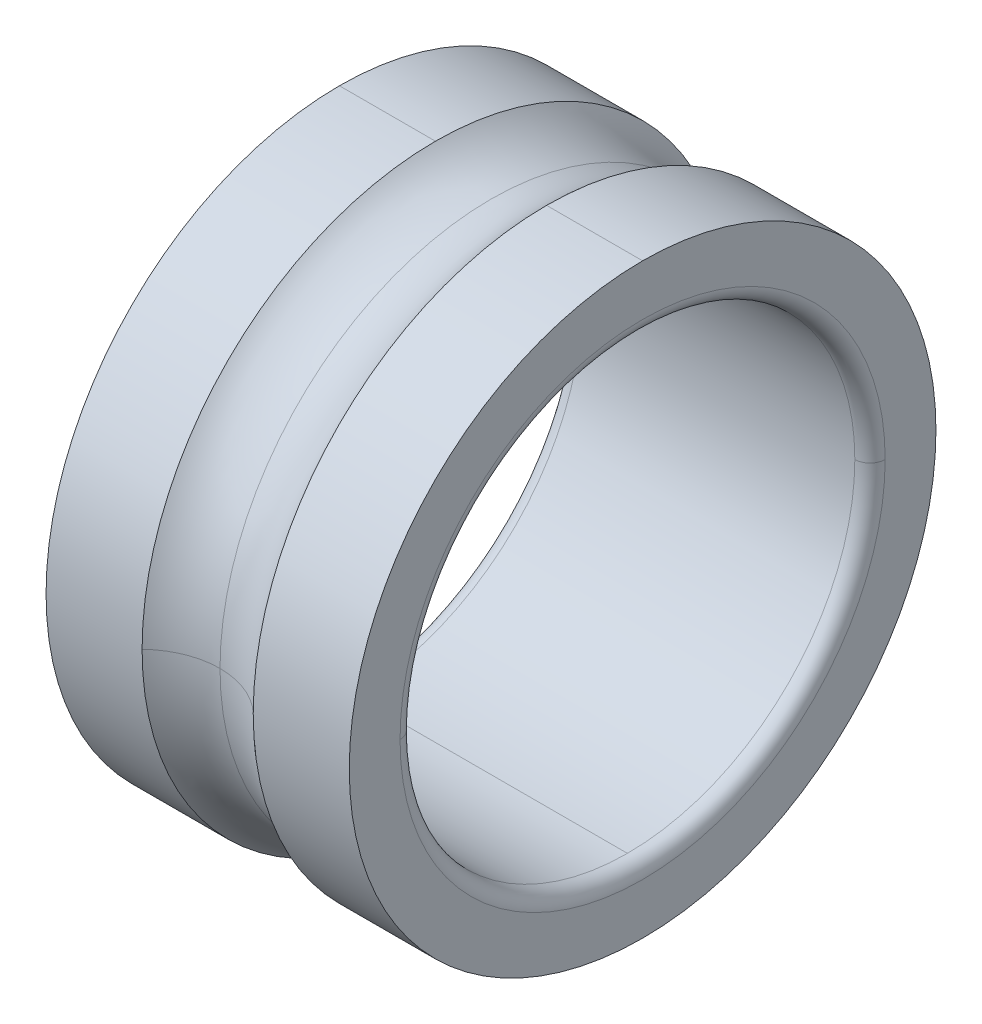
ISO-10303-21;
HEADER;
FILE_DESCRIPTION(('STEP AP214'),'2;1');
FILE_NAME('part.step','',(''),(''),'','','');
FILE_SCHEMA(('AUTOMOTIVE_DESIGN { 1 0 10303 214 1 1 1 1 }'));
ENDSEC;
DATA;
#1=APPLICATION_CONTEXT('core data for automotive mechanical design processes');
#2=APPLICATION_PROTOCOL_DEFINITION('international standard','automotive_design',2000,#1);
#3=PRODUCT_CONTEXT('',#1,'mechanical');
#4=PRODUCT('Part','Part','',(#3));
#5=PRODUCT_RELATED_PRODUCT_CATEGORY('part','',(#4));
#6=PRODUCT_DEFINITION_FORMATION('','',#4);
#7=PRODUCT_DEFINITION_CONTEXT('part definition',#1,'design');
#8=PRODUCT_DEFINITION('design','',#6,#7);
#9=PRODUCT_DEFINITION_SHAPE('','',#8);
#10=(LENGTH_UNIT() NAMED_UNIT(*) SI_UNIT(.MILLI.,.METRE.));
#11=(NAMED_UNIT(*) PLANE_ANGLE_UNIT() SI_UNIT($,.RADIAN.));
#12=(NAMED_UNIT(*) SI_UNIT($,.STERADIAN.) SOLID_ANGLE_UNIT());
#13=UNCERTAINTY_MEASURE_WITH_UNIT(LENGTH_MEASURE(1.E-05),#10,'distance_accuracy_value','');
#14=(GEOMETRIC_REPRESENTATION_CONTEXT(3) GLOBAL_UNCERTAINTY_ASSIGNED_CONTEXT((#13)) GLOBAL_UNIT_ASSIGNED_CONTEXT((#10,
#11,#12)) REPRESENTATION_CONTEXT('',''));
#15=CARTESIAN_POINT('',(0.,0.,0.));
#16=DIRECTION('',(0.,0.,1.));
#17=DIRECTION('',(1.,0.,0.));
#18=AXIS2_PLACEMENT_3D('',#15,#16,#17);
#19=CARTESIAN_POINT('',(5.04980252136563,0.,0.));
#20=DIRECTION('',(1.,0.,0.));
#21=DIRECTION('',(0.,1.,0.));
#22=AXIS2_PLACEMENT_3D('',#19,#20,#21);
#23=CYLINDRICAL_SURFACE('',#22,5.805);
#24=DIRECTION('',(1.,0.,0.));
#25=VECTOR('',#24,1.);
#26=CARTESIAN_POINT('',(5.04980252136563,5.805,0.));
#27=LINE('',#26,#25);
#28=CARTESIAN_POINT('',(4.09960504273125,5.805,0.));
#29=VERTEX_POINT('',#28);
#30=CARTESIAN_POINT('',(6.,5.805,0.));
#31=VERTEX_POINT('',#30);
#32=EDGE_CURVE('E153',#29,#31,#27,.T.);
#33=ORIENTED_EDGE('',*,*,#32,.T.);
#34=CARTESIAN_POINT('',(6.,0.,0.));
#35=DIRECTION('',(1.,0.,0.));
#36=DIRECTION('',(0.,1.,0.));
#37=AXIS2_PLACEMENT_3D('',#34,#35,#36);
#38=CIRCLE('',#37,5.805);
#39=CARTESIAN_POINT('',(6.,-5.805,0.));
#40=VERTEX_POINT('',#39);
#41=EDGE_CURVE('E213',#40,#31,#38,.T.);
#42=ORIENTED_EDGE('',*,*,#41,.F.);
#43=DIRECTION('',(-1.,0.,0.));
#44=VECTOR('',#43,1.);
#45=CARTESIAN_POINT('',(5.04980252136563,-5.805,0.));
#46=LINE('',#45,#44);
#47=CARTESIAN_POINT('',(4.09960504273125,-5.805,0.));
#48=VERTEX_POINT('',#47);
#49=EDGE_CURVE('E161',#40,#48,#46,.T.);
#50=ORIENTED_EDGE('',*,*,#49,.T.);
#51=CARTESIAN_POINT('',(4.09960504273125,0.,0.));
#52=DIRECTION('',(1.,0.,0.));
#53=DIRECTION('',(0.,1.,0.));
#54=AXIS2_PLACEMENT_3D('',#51,#52,#53);
#55=CIRCLE('',#54,5.805);
#56=CARTESIAN_POINT('',(4.09960504273125,0.,-5.805));
#57=VERTEX_POINT('',#56);
#58=EDGE_CURVE('E144',#48,#57,#55,.T.);
#59=ORIENTED_EDGE('',*,*,#58,.T.);
#60=CARTESIAN_POINT('',(4.09960504273125,0.,0.));
#61=DIRECTION('',(1.,0.,0.));
#62=DIRECTION('',(0.,1.,0.));
#63=AXIS2_PLACEMENT_3D('',#60,#61,#62);
#64=CIRCLE('',#63,5.805);
#65=EDGE_CURVE('E150',#57,#29,#64,.T.);
#66=ORIENTED_EDGE('',*,*,#65,.T.);
#67=EDGE_LOOP('',(#33,#42,#50,#59,#66));
#68=FACE_BOUND('',#67,.T.);
#69=ADVANCED_FACE('F17',(#68),#23,.T.);
#70=CARTESIAN_POINT('',(3.,0.,0.));
#71=DIRECTION('',(1.,0.,0.));
#72=DIRECTION('',(0.,0.,-1.));
#73=AXIS2_PLACEMENT_3D('',#70,#71,#72);
#74=TOROIDAL_SURFACE('',#73,6.95,1.5875);
#75=CARTESIAN_POINT('',(3.,0.,0.));
#76=DIRECTION('',(-1.,0.,0.));
#77=DIRECTION('',(0.,0.,1.));
#78=AXIS2_PLACEMENT_3D('',#75,#76,#77);
#79=CIRCLE('',#78,5.3625);
#80=CARTESIAN_POINT('',(3.,0.,5.3625));
#81=VERTEX_POINT('',#80);
#82=CARTESIAN_POINT('',(3.,0.,-5.3625));
#83=VERTEX_POINT('',#82);
#84=EDGE_CURVE('E133',#81,#83,#79,.T.);
#85=ORIENTED_EDGE('',*,*,#84,.T.);
#86=CARTESIAN_POINT('',(3.,0.,-6.95));
#87=DIRECTION('',(0.,-1.,0.));
#88=DIRECTION('',(0.,0.,-1.));
#89=AXIS2_PLACEMENT_3D('',#86,#87,#88);
#90=CIRCLE('',#89,1.5875);
#91=CARTESIAN_POINT('',(1.90039495726875,0.,-5.805));
#92=VERTEX_POINT('',#91);
#93=EDGE_CURVE('E127',#83,#92,#90,.T.);
#94=ORIENTED_EDGE('',*,*,#93,.T.);
#95=CARTESIAN_POINT('',(1.90039495726875,0.,0.));
#96=DIRECTION('',(1.,0.,0.));
#97=DIRECTION('',(0.,1.,0.));
#98=AXIS2_PLACEMENT_3D('',#95,#96,#97);
#99=CIRCLE('',#98,5.805);
#100=CARTESIAN_POINT('',(1.90039495726875,5.805,0.));
#101=VERTEX_POINT('',#100);
#102=EDGE_CURVE('E11',#92,#101,#99,.T.);
#103=ORIENTED_EDGE('',*,*,#102,.T.);
#104=CARTESIAN_POINT('',(1.90039495726875,0.,0.));
#105=DIRECTION('',(1.,0.,0.));
#106=DIRECTION('',(0.,1.,0.));
#107=AXIS2_PLACEMENT_3D('',#104,#105,#106);
#108=CIRCLE('',#107,5.805);
#109=CARTESIAN_POINT('',(1.90039495726875,0.,5.805));
#110=VERTEX_POINT('',#109);
#111=EDGE_CURVE('E126',#101,#110,#108,.T.);
#112=ORIENTED_EDGE('',*,*,#111,.T.);
#113=CARTESIAN_POINT('',(3.,0.,6.95));
#114=DIRECTION('',(0.,-1.,0.));
#115=DIRECTION('',(0.,0.,1.));
#116=AXIS2_PLACEMENT_3D('',#113,#114,#115);
#117=CIRCLE('',#116,1.5875);
#118=EDGE_CURVE('E170',#110,#81,#117,.T.);
#119=ORIENTED_EDGE('',*,*,#118,.T.);
#120=EDGE_LOOP('',(#85,#94,#103,#112,#119));
#121=FACE_BOUND('',#120,.T.);
#122=ADVANCED_FACE('F260',(#121),#74,.F.);
#123=CARTESIAN_POINT('',(0.950197478634374,0.,0.));
#124=DIRECTION('',(1.,0.,0.));
#125=DIRECTION('',(0.,1.,0.));
#126=AXIS2_PLACEMENT_3D('',#123,#124,#125);
#127=CYLINDRICAL_SURFACE('',#126,5.805);
#128=DIRECTION('',(1.,0.,0.));
#129=VECTOR('',#128,1.);
#130=CARTESIAN_POINT('',(0.950197478634374,5.805,0.));
#131=LINE('',#130,#129);
#132=CARTESIAN_POINT('',(0.,5.805,0.));
#133=VERTEX_POINT('',#132);
#134=EDGE_CURVE('E113',#133,#101,#131,.T.);
#135=ORIENTED_EDGE('',*,*,#134,.T.);
#136=ORIENTED_EDGE('',*,*,#102,.F.);
#137=CARTESIAN_POINT('',(1.90039495726875,0.,0.));
#138=DIRECTION('',(1.,0.,0.));
#139=DIRECTION('',(0.,1.,0.));
#140=AXIS2_PLACEMENT_3D('',#137,#138,#139);
#141=CIRCLE('',#140,5.805);
#142=CARTESIAN_POINT('',(1.90039495726875,-5.805,0.));
#143=VERTEX_POINT('',#142);
#144=EDGE_CURVE('E130',#143,#92,#141,.T.);
#145=ORIENTED_EDGE('',*,*,#144,.F.);
#146=DIRECTION('',(-1.,0.,0.));
#147=VECTOR('',#146,1.);
#148=CARTESIAN_POINT('',(0.950197478634374,-5.805,0.));
#149=LINE('',#148,#147);
#150=CARTESIAN_POINT('',(0.,-5.805,0.));
#151=VERTEX_POINT('',#150);
#152=EDGE_CURVE('E115',#143,#151,#149,.T.);
#153=ORIENTED_EDGE('',*,*,#152,.T.);
#154=CARTESIAN_POINT('',(0.,0.,0.));
#155=DIRECTION('',(1.,0.,0.));
#156=DIRECTION('',(0.,1.,0.));
#157=AXIS2_PLACEMENT_3D('',#154,#155,#156);
#158=CIRCLE('',#157,5.805);
#159=EDGE_CURVE('E24',#151,#133,#158,.T.);
#160=ORIENTED_EDGE('',*,*,#159,.T.);
#161=EDGE_LOOP('',(#135,#136,#145,#153,#160));
#162=FACE_BOUND('',#161,.T.);
#163=ADVANCED_FACE('F111',(#162),#127,.T.);
#164=CARTESIAN_POINT('',(0.,5.3025,0.));
#165=DIRECTION('',(-1.,0.,0.));
#166=DIRECTION('',(0.,0.,1.));
#167=AXIS2_PLACEMENT_3D('',#164,#165,#166);
#168=PLANE('',#167);
#169=CARTESIAN_POINT('',(0.,0.,0.));
#170=DIRECTION('',(1.,0.,0.));
#171=DIRECTION('',(0.,1.,0.));
#172=AXIS2_PLACEMENT_3D('',#169,#170,#171);
#173=CIRCLE('',#172,4.8);
#174=CARTESIAN_POINT('',(0.,0.,4.8));
#175=VERTEX_POINT('',#174);
#176=CARTESIAN_POINT('',(0.,0.,-4.8));
#177=VERTEX_POINT('',#176);
#178=EDGE_CURVE('E118',#175,#177,#173,.T.);
#179=ORIENTED_EDGE('',*,*,#178,.T.);
#180=CARTESIAN_POINT('',(0.,0.,0.));
#181=DIRECTION('',(1.,0.,0.));
#182=DIRECTION('',(0.,1.,0.));
#183=AXIS2_PLACEMENT_3D('',#180,#181,#182);
#184=CIRCLE('',#183,4.8);
#185=EDGE_CURVE('E191',#177,#175,#184,.T.);
#186=ORIENTED_EDGE('',*,*,#185,.T.);
#187=EDGE_LOOP('',(#179,#186));
#188=FACE_BOUND('',#187,.T.);
#189=CARTESIAN_POINT('',(0.,0.,0.));
#190=DIRECTION('',(1.,0.,0.));
#191=DIRECTION('',(0.,1.,0.));
#192=AXIS2_PLACEMENT_3D('',#189,#190,#191);
#193=CIRCLE('',#192,5.805);
#194=EDGE_CURVE('E119',#133,#151,#193,.T.);
#195=ORIENTED_EDGE('',*,*,#194,.F.);
#196=ORIENTED_EDGE('',*,*,#159,.F.);
#197=EDGE_LOOP('',(#195,#196));
#198=FACE_BOUND('',#197,.T.);
#199=ADVANCED_FACE('F120',(#188,#198),#168,.T.);
#200=CARTESIAN_POINT('',(0.3,0.,0.));
#201=DIRECTION('',(1.,0.,0.));
#202=DIRECTION('',(0.,0.,-1.));
#203=AXIS2_PLACEMENT_3D('',#200,#201,#202);
#204=TOROIDAL_SURFACE('',#203,4.8,0.3);
#205=CARTESIAN_POINT('',(0.3,0.,-4.8));
#206=DIRECTION('',(0.,-1.,0.));
#207=DIRECTION('',(0.,0.,-1.));
#208=AXIS2_PLACEMENT_3D('',#205,#206,#207);
#209=CIRCLE('',#208,0.3);
#210=CARTESIAN_POINT('',(0.3,0.,-4.5));
#211=VERTEX_POINT('',#210);
#212=EDGE_CURVE('E179',#211,#177,#209,.T.);
#213=ORIENTED_EDGE('',*,*,#212,.T.);
#214=ORIENTED_EDGE('',*,*,#178,.F.);
#215=CARTESIAN_POINT('',(0.3,0.,4.8));
#216=DIRECTION('',(0.,-1.,0.));
#217=DIRECTION('',(0.,0.,1.));
#218=AXIS2_PLACEMENT_3D('',#215,#216,#217);
#219=CIRCLE('',#218,0.3);
#220=CARTESIAN_POINT('',(0.3,0.,4.5));
#221=VERTEX_POINT('',#220);
#222=EDGE_CURVE('E188',#175,#221,#219,.T.);
#223=ORIENTED_EDGE('',*,*,#222,.T.);
#224=CARTESIAN_POINT('',(0.3,0.,0.));
#225=DIRECTION('',(1.,0.,0.));
#226=DIRECTION('',(0.,1.,0.));
#227=AXIS2_PLACEMENT_3D('',#224,#225,#226);
#228=CIRCLE('',#227,4.5);
#229=CARTESIAN_POINT('',(0.3,-4.5,0.));
#230=VERTEX_POINT('',#229);
#231=EDGE_CURVE('E158',#221,#230,#228,.T.);
#232=ORIENTED_EDGE('',*,*,#231,.T.);
#233=CARTESIAN_POINT('',(0.3,0.,0.));
#234=DIRECTION('',(1.,0.,0.));
#235=DIRECTION('',(0.,1.,0.));
#236=AXIS2_PLACEMENT_3D('',#233,#234,#235);
#237=CIRCLE('',#236,4.5);
#238=EDGE_CURVE('E197',#230,#211,#237,.T.);
#239=ORIENTED_EDGE('',*,*,#238,.T.);
#240=EDGE_LOOP('',(#213,#214,#223,#232,#239));
#241=FACE_BOUND('',#240,.T.);
#242=ADVANCED_FACE('F218',(#241),#204,.T.);
#243=CARTESIAN_POINT('',(3.,0.,0.));
#244=DIRECTION('',(1.,0.,0.));
#245=DIRECTION('',(0.,1.,0.));
#246=AXIS2_PLACEMENT_3D('',#243,#244,#245);
#247=CYLINDRICAL_SURFACE('',#246,4.5);
#248=DIRECTION('',(1.,0.,0.));
#249=VECTOR('',#248,1.);
#250=CARTESIAN_POINT('',(3.,4.5,0.));
#251=LINE('',#250,#249);
#252=CARTESIAN_POINT('',(0.3,4.5,0.));
#253=VERTEX_POINT('',#252);
#254=CARTESIAN_POINT('',(5.7,4.5,0.));
#255=VERTEX_POINT('',#254);
#256=EDGE_CURVE('E194',#253,#255,#251,.T.);
#257=ORIENTED_EDGE('',*,*,#256,.T.);
#258=CARTESIAN_POINT('',(5.7,0.,0.));
#259=DIRECTION('',(1.,0.,0.));
#260=DIRECTION('',(0.,1.,0.));
#261=AXIS2_PLACEMENT_3D('',#258,#259,#260);
#262=CIRCLE('',#261,4.5);
#263=CARTESIAN_POINT('',(5.7,0.,4.5));
#264=VERTEX_POINT('',#263);
#265=EDGE_CURVE('E139',#255,#264,#262,.T.);
#266=ORIENTED_EDGE('',*,*,#265,.T.);
#267=CARTESIAN_POINT('',(5.7,0.,0.));
#268=DIRECTION('',(1.,0.,0.));
#269=DIRECTION('',(0.,1.,0.));
#270=AXIS2_PLACEMENT_3D('',#267,#268,#269);
#271=CIRCLE('',#270,4.5);
#272=CARTESIAN_POINT('',(5.7,-4.5,0.));
#273=VERTEX_POINT('',#272);
#274=EDGE_CURVE('E31',#264,#273,#271,.T.);
#275=ORIENTED_EDGE('',*,*,#274,.T.);
#276=DIRECTION('',(-1.,0.,0.));
#277=VECTOR('',#276,1.);
#278=CARTESIAN_POINT('',(3.,-4.5,0.));
#279=LINE('',#278,#277);
#280=EDGE_CURVE('E199',#273,#230,#279,.T.);
#281=ORIENTED_EDGE('',*,*,#280,.T.);
#282=ORIENTED_EDGE('',*,*,#231,.F.);
#283=CARTESIAN_POINT('',(0.3,0.,0.));
#284=DIRECTION('',(1.,0.,0.));
#285=DIRECTION('',(0.,1.,0.));
#286=AXIS2_PLACEMENT_3D('',#283,#284,#285);
#287=CIRCLE('',#286,4.5);
#288=EDGE_CURVE('E185',#253,#221,#287,.T.);
#289=ORIENTED_EDGE('',*,*,#288,.F.);
#290=EDGE_LOOP('',(#257,#266,#275,#281,#282,#289));
#291=FACE_BOUND('',#290,.T.);
#292=ADVANCED_FACE('F225',(#291),#247,.F.);
#293=CARTESIAN_POINT('',(5.7,0.,0.));
#294=DIRECTION('',(1.,0.,0.));
#295=DIRECTION('',(0.,0.,-1.));
#296=AXIS2_PLACEMENT_3D('',#293,#294,#295);
#297=TOROIDAL_SURFACE('',#296,4.8,0.3);
#298=CARTESIAN_POINT('',(5.7,0.,-4.8));
#299=DIRECTION('',(0.,-1.,0.));
#300=DIRECTION('',(0.,0.,-1.));
#301=AXIS2_PLACEMENT_3D('',#298,#299,#300);
#302=CIRCLE('',#301,0.3);
#303=CARTESIAN_POINT('',(6.,0.,-4.8));
#304=VERTEX_POINT('',#303);
#305=CARTESIAN_POINT('',(5.7,0.,-4.5));
#306=VERTEX_POINT('',#305);
#307=EDGE_CURVE('E208',#304,#306,#302,.T.);
#308=ORIENTED_EDGE('',*,*,#307,.T.);
#309=CARTESIAN_POINT('',(5.7,0.,0.));
#310=DIRECTION('',(1.,0.,0.));
#311=DIRECTION('',(0.,1.,0.));
#312=AXIS2_PLACEMENT_3D('',#309,#310,#311);
#313=CIRCLE('',#312,4.5);
#314=EDGE_CURVE('E202',#273,#306,#313,.T.);
#315=ORIENTED_EDGE('',*,*,#314,.F.);
#316=ORIENTED_EDGE('',*,*,#274,.F.);
#317=CARTESIAN_POINT('',(5.7,0.,4.8));
#318=DIRECTION('',(0.,-1.,0.));
#319=DIRECTION('',(0.,0.,1.));
#320=AXIS2_PLACEMENT_3D('',#317,#318,#319);
#321=CIRCLE('',#320,0.3);
#322=CARTESIAN_POINT('',(6.,0.,4.8));
#323=VERTEX_POINT('',#322);
#324=EDGE_CURVE('E137',#264,#323,#321,.T.);
#325=ORIENTED_EDGE('',*,*,#324,.T.);
#326=CARTESIAN_POINT('',(6.,0.,0.));
#327=DIRECTION('',(1.,0.,0.));
#328=DIRECTION('',(0.,1.,0.));
#329=AXIS2_PLACEMENT_3D('',#326,#327,#328);
#330=CIRCLE('',#329,4.8);
#331=EDGE_CURVE('E38',#323,#304,#330,.T.);
#332=ORIENTED_EDGE('',*,*,#331,.T.);
#333=EDGE_LOOP('',(#308,#315,#316,#325,#332));
#334=FACE_BOUND('',#333,.T.);
#335=ADVANCED_FACE('F238',(#334),#297,.T.);
#336=CARTESIAN_POINT('',(6.,5.3025,0.));
#337=DIRECTION('',(1.,0.,0.));
#338=DIRECTION('',(0.,1.,0.));
#339=AXIS2_PLACEMENT_3D('',#336,#337,#338);
#340=PLANE('',#339);
#341=CARTESIAN_POINT('',(6.,0.,0.));
#342=DIRECTION('',(1.,0.,0.));
#343=DIRECTION('',(0.,1.,0.));
#344=AXIS2_PLACEMENT_3D('',#341,#342,#343);
#345=CIRCLE('',#344,4.8);
#346=EDGE_CURVE('E140',#304,#323,#345,.T.);
#347=ORIENTED_EDGE('',*,*,#346,.F.);
#348=ORIENTED_EDGE('',*,*,#331,.F.);
#349=EDGE_LOOP('',(#347,#348));
#350=FACE_BOUND('',#349,.T.);
#351=CARTESIAN_POINT('',(6.,0.,0.));
#352=DIRECTION('',(1.,0.,0.));
#353=DIRECTION('',(0.,1.,0.));
#354=AXIS2_PLACEMENT_3D('',#351,#352,#353);
#355=CIRCLE('',#354,5.805);
#356=EDGE_CURVE('E163',#31,#40,#355,.T.);
#357=ORIENTED_EDGE('',*,*,#356,.T.);
#358=ORIENTED_EDGE('',*,*,#41,.T.);
#359=EDGE_LOOP('',(#357,#358));
#360=FACE_BOUND('',#359,.T.);
#361=ADVANCED_FACE('F239',(#350,#360),#340,.T.);
#362=CARTESIAN_POINT('',(5.7,0.,0.));
#363=DIRECTION('',(1.,0.,0.));
#364=DIRECTION('',(0.,0.,-1.));
#365=AXIS2_PLACEMENT_3D('',#362,#363,#364);
#366=TOROIDAL_SURFACE('',#365,4.8,0.3);
#367=ORIENTED_EDGE('',*,*,#307,.F.);
#368=ORIENTED_EDGE('',*,*,#346,.T.);
#369=ORIENTED_EDGE('',*,*,#324,.F.);
#370=ORIENTED_EDGE('',*,*,#265,.F.);
#371=CARTESIAN_POINT('',(5.7,0.,0.));
#372=DIRECTION('',(1.,0.,0.));
#373=DIRECTION('',(0.,1.,0.));
#374=AXIS2_PLACEMENT_3D('',#371,#372,#373);
#375=CIRCLE('',#374,4.5);
#376=EDGE_CURVE('E205',#306,#255,#375,.T.);
#377=ORIENTED_EDGE('',*,*,#376,.F.);
#378=EDGE_LOOP('',(#367,#368,#369,#370,#377));
#379=FACE_BOUND('',#378,.T.);
#380=ADVANCED_FACE('F237',(#379),#366,.T.);
#381=CARTESIAN_POINT('',(3.,0.,0.));
#382=DIRECTION('',(1.,0.,0.));
#383=DIRECTION('',(0.,1.,0.));
#384=AXIS2_PLACEMENT_3D('',#381,#382,#383);
#385=CYLINDRICAL_SURFACE('',#384,4.5);
#386=ORIENTED_EDGE('',*,*,#256,.F.);
#387=CARTESIAN_POINT('',(0.3,0.,0.));
#388=DIRECTION('',(1.,0.,0.));
#389=DIRECTION('',(0.,1.,0.));
#390=AXIS2_PLACEMENT_3D('',#387,#388,#389);
#391=CIRCLE('',#390,4.5);
#392=EDGE_CURVE('E182',#211,#253,#391,.T.);
#393=ORIENTED_EDGE('',*,*,#392,.F.);
#394=ORIENTED_EDGE('',*,*,#238,.F.);
#395=ORIENTED_EDGE('',*,*,#280,.F.);
#396=ORIENTED_EDGE('',*,*,#314,.T.);
#397=ORIENTED_EDGE('',*,*,#376,.T.);
#398=EDGE_LOOP('',(#386,#393,#394,#395,#396,#397));
#399=FACE_BOUND('',#398,.T.);
#400=ADVANCED_FACE('F227',(#399),#385,.F.);
#401=CARTESIAN_POINT('',(0.3,0.,0.));
#402=DIRECTION('',(1.,0.,0.));
#403=DIRECTION('',(0.,0.,-1.));
#404=AXIS2_PLACEMENT_3D('',#401,#402,#403);
#405=TOROIDAL_SURFACE('',#404,4.8,0.3);
#406=ORIENTED_EDGE('',*,*,#212,.F.);
#407=ORIENTED_EDGE('',*,*,#392,.T.);
#408=ORIENTED_EDGE('',*,*,#288,.T.);
#409=ORIENTED_EDGE('',*,*,#222,.F.);
#410=ORIENTED_EDGE('',*,*,#185,.F.);
#411=EDGE_LOOP('',(#406,#407,#408,#409,#410));
#412=FACE_BOUND('',#411,.T.);
#413=ADVANCED_FACE('F231',(#412),#405,.T.);
#414=CARTESIAN_POINT('',(0.950197478634374,0.,0.));
#415=DIRECTION('',(1.,0.,0.));
#416=DIRECTION('',(0.,1.,0.));
#417=AXIS2_PLACEMENT_3D('',#414,#415,#416);
#418=CYLINDRICAL_SURFACE('',#417,5.805);
#419=ORIENTED_EDGE('',*,*,#134,.F.);
#420=ORIENTED_EDGE('',*,*,#194,.T.);
#421=ORIENTED_EDGE('',*,*,#152,.F.);
#422=CARTESIAN_POINT('',(1.90039495726875,0.,0.));
#423=DIRECTION('',(1.,0.,0.));
#424=DIRECTION('',(0.,1.,0.));
#425=AXIS2_PLACEMENT_3D('',#422,#423,#424);
#426=CIRCLE('',#425,5.805);
#427=EDGE_CURVE('E172',#110,#143,#426,.T.);
#428=ORIENTED_EDGE('',*,*,#427,.F.);
#429=ORIENTED_EDGE('',*,*,#111,.F.);
#430=EDGE_LOOP('',(#419,#420,#421,#428,#429));
#431=FACE_BOUND('',#430,.T.);
#432=ADVANCED_FACE('F124',(#431),#418,.T.);
#433=CARTESIAN_POINT('',(3.,0.,0.));
#434=DIRECTION('',(1.,0.,0.));
#435=DIRECTION('',(0.,0.,-1.));
#436=AXIS2_PLACEMENT_3D('',#433,#434,#435);
#437=TOROIDAL_SURFACE('',#436,6.95,1.5875);
#438=CARTESIAN_POINT('',(3.,0.,0.));
#439=DIRECTION('',(-1.,0.,0.));
#440=DIRECTION('',(0.,0.,1.));
#441=AXIS2_PLACEMENT_3D('',#438,#439,#440);
#442=CIRCLE('',#441,5.3625);
#443=EDGE_CURVE('E147',#83,#81,#442,.T.);
#444=ORIENTED_EDGE('',*,*,#443,.T.);
#445=ORIENTED_EDGE('',*,*,#118,.F.);
#446=ORIENTED_EDGE('',*,*,#427,.T.);
#447=ORIENTED_EDGE('',*,*,#144,.T.);
#448=ORIENTED_EDGE('',*,*,#93,.F.);
#449=EDGE_LOOP('',(#444,#445,#446,#447,#448));
#450=FACE_BOUND('',#449,.T.);
#451=ADVANCED_FACE('F263',(#450),#437,.F.);
#452=CARTESIAN_POINT('',(5.04980252136563,0.,0.));
#453=DIRECTION('',(1.,0.,0.));
#454=DIRECTION('',(0.,1.,0.));
#455=AXIS2_PLACEMENT_3D('',#452,#453,#454);
#456=CYLINDRICAL_SURFACE('',#455,5.805);
#457=ORIENTED_EDGE('',*,*,#32,.F.);
#458=CARTESIAN_POINT('',(4.09960504273125,0.,0.));
#459=DIRECTION('',(1.,0.,0.));
#460=DIRECTION('',(0.,1.,0.));
#461=AXIS2_PLACEMENT_3D('',#458,#459,#460);
#462=CIRCLE('',#461,5.805);
#463=CARTESIAN_POINT('',(4.09960504273125,0.,5.805));
#464=VERTEX_POINT('',#463);
#465=EDGE_CURVE('E143',#29,#464,#462,.T.);
#466=ORIENTED_EDGE('',*,*,#465,.T.);
#467=CARTESIAN_POINT('',(4.09960504273125,0.,0.));
#468=DIRECTION('',(1.,0.,0.));
#469=DIRECTION('',(0.,1.,0.));
#470=AXIS2_PLACEMENT_3D('',#467,#468,#469);
#471=CIRCLE('',#470,5.805);
#472=EDGE_CURVE('E146',#464,#48,#471,.T.);
#473=ORIENTED_EDGE('',*,*,#472,.T.);
#474=ORIENTED_EDGE('',*,*,#49,.F.);
#475=ORIENTED_EDGE('',*,*,#356,.F.);
#476=EDGE_LOOP('',(#457,#466,#473,#474,#475));
#477=FACE_BOUND('',#476,.T.);
#478=ADVANCED_FACE('F246',(#477),#456,.T.);
#479=CARTESIAN_POINT('',(3.,0.,0.));
#480=DIRECTION('',(1.,0.,0.));
#481=DIRECTION('',(0.,0.,-1.));
#482=AXIS2_PLACEMENT_3D('',#479,#480,#481);
#483=TOROIDAL_SURFACE('',#482,6.95,1.5875);
#484=ORIENTED_EDGE('',*,*,#443,.F.);
#485=CARTESIAN_POINT('',(3.,0.,-6.95));
#486=DIRECTION('',(0.,-1.,0.));
#487=DIRECTION('',(0.,0.,-1.));
#488=AXIS2_PLACEMENT_3D('',#485,#486,#487);
#489=CIRCLE('',#488,1.5875);
#490=EDGE_CURVE('E156',#57,#83,#489,.T.);
#491=ORIENTED_EDGE('',*,*,#490,.F.);
#492=ORIENTED_EDGE('',*,*,#58,.F.);
#493=ORIENTED_EDGE('',*,*,#472,.F.);
#494=CARTESIAN_POINT('',(3.,0.,6.95));
#495=DIRECTION('',(0.,-1.,0.));
#496=DIRECTION('',(0.,0.,1.));
#497=AXIS2_PLACEMENT_3D('',#494,#495,#496);
#498=CIRCLE('',#497,1.5875);
#499=EDGE_CURVE('E136',#81,#464,#498,.T.);
#500=ORIENTED_EDGE('',*,*,#499,.F.);
#501=EDGE_LOOP('',(#484,#491,#492,#493,#500));
#502=FACE_BOUND('',#501,.T.);
#503=ADVANCED_FACE('F258',(#502),#483,.F.);
#504=CARTESIAN_POINT('',(3.,0.,0.));
#505=DIRECTION('',(1.,0.,0.));
#506=DIRECTION('',(0.,0.,-1.));
#507=AXIS2_PLACEMENT_3D('',#504,#505,#506);
#508=TOROIDAL_SURFACE('',#507,6.95,1.5875);
#509=ORIENTED_EDGE('',*,*,#84,.F.);
#510=ORIENTED_EDGE('',*,*,#499,.T.);
#511=ORIENTED_EDGE('',*,*,#465,.F.);
#512=ORIENTED_EDGE('',*,*,#65,.F.);
#513=ORIENTED_EDGE('',*,*,#490,.T.);
#514=EDGE_LOOP('',(#509,#510,#511,#512,#513));
#515=FACE_BOUND('',#514,.T.);
#516=ADVANCED_FACE('F255',(#515),#508,.F.);
#517=CLOSED_SHELL('',(#69,#122,#163,#199,#242,#292,#335,#361,#380,#400,#413,#432,#451,#478,#503,#516));
#518=MANIFOLD_SOLID_BREP('B1',#517);
#519=ADVANCED_BREP_SHAPE_REPRESENTATION('',(#18,#518),#14);
#520=SHAPE_DEFINITION_REPRESENTATION(#9,#519);
ENDSEC;
END-ISO-10303-21;
